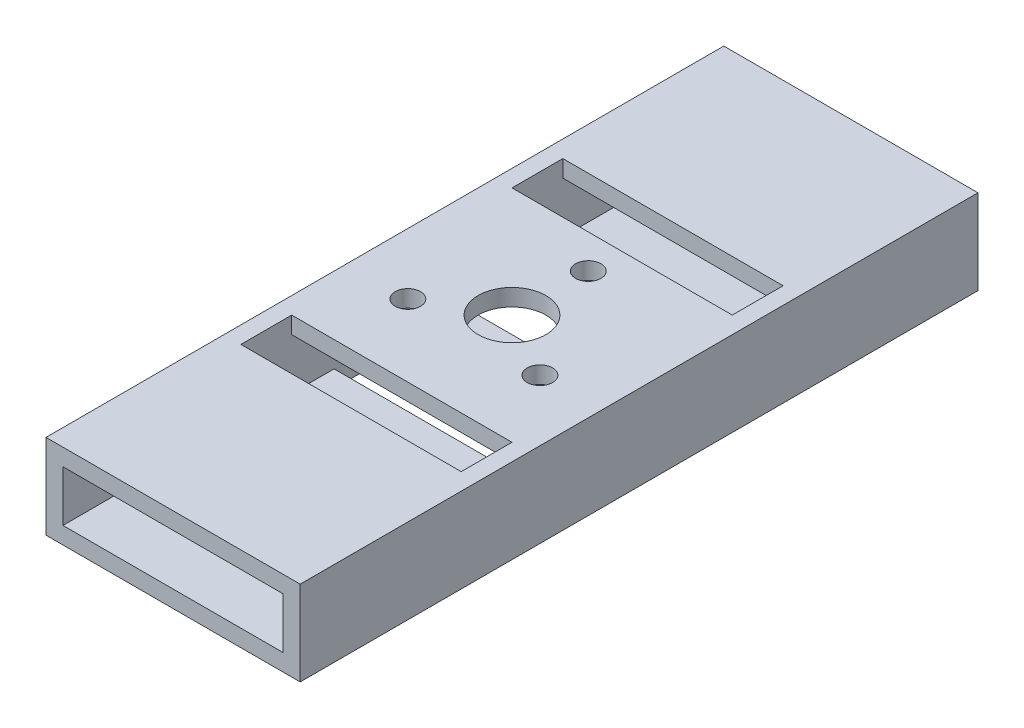
ISO-10303-21;
HEADER;
FILE_DESCRIPTION(('STEP AP214'),'2;1');
FILE_NAME('part.step','',(''),(''),'','','');
FILE_SCHEMA(('AUTOMOTIVE_DESIGN { 1 0 10303 214 1 1 1 1 }'));
ENDSEC;
DATA;
#1=APPLICATION_CONTEXT('core data for automotive mechanical design processes');
#2=APPLICATION_PROTOCOL_DEFINITION('international standard','automotive_design',2000,#1);
#3=PRODUCT_CONTEXT('',#1,'mechanical');
#4=PRODUCT('Part','Part','',(#3));
#5=PRODUCT_RELATED_PRODUCT_CATEGORY('part','',(#4));
#6=PRODUCT_DEFINITION_FORMATION('','',#4);
#7=PRODUCT_DEFINITION_CONTEXT('part definition',#1,'design');
#8=PRODUCT_DEFINITION('design','',#6,#7);
#9=PRODUCT_DEFINITION_SHAPE('','',#8);
#10=(LENGTH_UNIT() NAMED_UNIT(*) SI_UNIT(.MILLI.,.METRE.));
#11=(NAMED_UNIT(*) PLANE_ANGLE_UNIT() SI_UNIT($,.RADIAN.));
#12=(NAMED_UNIT(*) SI_UNIT($,.STERADIAN.) SOLID_ANGLE_UNIT());
#13=UNCERTAINTY_MEASURE_WITH_UNIT(LENGTH_MEASURE(1.E-05),#10,'distance_accuracy_value','');
#14=(GEOMETRIC_REPRESENTATION_CONTEXT(3) GLOBAL_UNCERTAINTY_ASSIGNED_CONTEXT((#13)) GLOBAL_UNIT_ASSIGNED_CONTEXT((#10,
#11,#12)) REPRESENTATION_CONTEXT('',''));
#15=CARTESIAN_POINT('',(0.,0.,0.));
#16=DIRECTION('',(0.,0.,1.));
#17=DIRECTION('',(1.,0.,0.));
#18=AXIS2_PLACEMENT_3D('',#15,#16,#17);
#19=CARTESIAN_POINT('',(-13.,-3.,80.));
#20=DIRECTION('',(0.,1.,0.));
#21=DIRECTION('',(0.,0.,1.));
#22=AXIS2_PLACEMENT_3D('',#19,#20,#21);
#23=PLANE('',#22);
#24=DIRECTION('',(1.,0.,0.));
#25=VECTOR('',#24,1.);
#26=CARTESIAN_POINT('',(-13.,-3.,40.));
#27=LINE('',#26,#25);
#28=CARTESIAN_POINT('',(4.,-3.,40.));
#29=VERTEX_POINT('',#28);
#30=CARTESIAN_POINT('',(13.,-3.,40.));
#31=VERTEX_POINT('',#30);
#32=EDGE_CURVE('E62',#29,#31,#27,.T.);
#33=ORIENTED_EDGE('',*,*,#32,.T.);
#34=DIRECTION('',(0.,0.,-1.));
#35=VECTOR('',#34,1.);
#36=CARTESIAN_POINT('',(13.,-3.,80.));
#37=LINE('',#36,#35);
#38=CARTESIAN_POINT('',(13.,-3.,34.));
#39=VERTEX_POINT('',#38);
#40=EDGE_CURVE('E248',#31,#39,#37,.T.);
#41=ORIENTED_EDGE('',*,*,#40,.T.);
#42=DIRECTION('',(-1.,0.,0.));
#43=VECTOR('',#42,1.);
#44=CARTESIAN_POINT('',(-13.,-3.,34.));
#45=LINE('',#44,#43);
#46=CARTESIAN_POINT('',(-13.,-3.,34.));
#47=VERTEX_POINT('',#46);
#48=EDGE_CURVE('E387',#39,#47,#45,.T.);
#49=ORIENTED_EDGE('',*,*,#48,.T.);
#50=DIRECTION('',(0.,0.,-1.));
#51=VECTOR('',#50,1.);
#52=CARTESIAN_POINT('',(-13.,-3.,80.));
#53=LINE('',#52,#51);
#54=CARTESIAN_POINT('',(-13.,-3.,40.));
#55=VERTEX_POINT('',#54);
#56=EDGE_CURVE('E251',#55,#47,#53,.T.);
#57=ORIENTED_EDGE('',*,*,#56,.F.);
#58=CARTESIAN_POINT('',(-4.,-3.,40.));
#59=VERTEX_POINT('',#58);
#60=EDGE_CURVE('E234',#55,#59,#27,.T.);
#61=ORIENTED_EDGE('',*,*,#60,.T.);
#62=CARTESIAN_POINT('',(0.,-3.,40.));
#63=DIRECTION('',(0.,1.,0.));
#64=DIRECTION('',(0.,0.,1.));
#65=AXIS2_PLACEMENT_3D('',#62,#63,#64);
#66=CIRCLE('',#65,4.);
#67=EDGE_CURVE('E285',#29,#59,#66,.T.);
#68=ORIENTED_EDGE('',*,*,#67,.F.);
#69=EDGE_LOOP('',(#33,#41,#49,#57,#61,#68));
#70=FACE_BOUND('',#69,.T.);
#71=ADVANCED_FACE('F47',(#70),#23,.T.);
#72=DIRECTION('',(1.,0.,0.));
#73=VECTOR('',#72,1.);
#74=CARTESIAN_POINT('',(-13.,-3.,28.));
#75=LINE('',#74,#73);
#76=CARTESIAN_POINT('',(-13.,-3.,28.));
#77=VERTEX_POINT('',#76);
#78=CARTESIAN_POINT('',(13.,-3.,28.));
#79=VERTEX_POINT('',#78);
#80=EDGE_CURVE('E379',#77,#79,#75,.T.);
#81=ORIENTED_EDGE('',*,*,#80,.T.);
#82=CARTESIAN_POINT('',(13.,-3.,0.));
#83=VERTEX_POINT('',#82);
#84=EDGE_CURVE('E250',#79,#83,#37,.T.);
#85=ORIENTED_EDGE('',*,*,#84,.T.);
#86=DIRECTION('',(1.,0.,0.));
#87=VECTOR('',#86,1.);
#88=CARTESIAN_POINT('',(-13.,-3.,0.));
#89=LINE('',#88,#87);
#90=CARTESIAN_POINT('',(-13.,-3.,0.));
#91=VERTEX_POINT('',#90);
#92=EDGE_CURVE('E275',#91,#83,#89,.T.);
#93=ORIENTED_EDGE('',*,*,#92,.F.);
#94=EDGE_CURVE('E247',#77,#91,#53,.T.);
#95=ORIENTED_EDGE('',*,*,#94,.F.);
#96=EDGE_LOOP('',(#81,#85,#93,#95));
#97=FACE_BOUND('',#96,.T.);
#98=CARTESIAN_POINT('',(0.,-3.,24.));
#99=DIRECTION('',(0.,1.,0.));
#100=DIRECTION('',(0.,0.,1.));
#101=AXIS2_PLACEMENT_3D('',#98,#99,#100);
#102=CIRCLE('',#101,2.);
#103=CARTESIAN_POINT('',(0.,-3.,26.));
#104=VERTEX_POINT('',#103);
#105=EDGE_CURVE('E314',#104,#104,#102,.T.);
#106=ORIENTED_EDGE('',*,*,#105,.F.);
#107=EDGE_LOOP('',(#106));
#108=FACE_BOUND('',#107,.T.);
#109=ADVANCED_FACE('F520',(#97,#108),#23,.T.);
#110=CARTESIAN_POINT('',(-13.,3.,80.));
#111=DIRECTION('',(0.,-1.,0.));
#112=DIRECTION('',(0.,0.,-1.));
#113=AXIS2_PLACEMENT_3D('',#110,#111,#112);
#114=PLANE('',#113);
#115=DIRECTION('',(0.,0.,-1.));
#116=VECTOR('',#115,1.);
#117=CARTESIAN_POINT('',(-13.,3.,80.));
#118=LINE('',#117,#116);
#119=CARTESIAN_POINT('',(-13.,3.,80.));
#120=VERTEX_POINT('',#119);
#121=CARTESIAN_POINT('',(-13.,3.,59.));
#122=VERTEX_POINT('',#121);
#123=EDGE_CURVE('E426',#120,#122,#118,.T.);
#124=ORIENTED_EDGE('',*,*,#123,.T.);
#125=DIRECTION('',(-1.,0.,0.));
#126=VECTOR('',#125,1.);
#127=CARTESIAN_POINT('',(-13.,3.,59.));
#128=LINE('',#127,#126);
#129=CARTESIAN_POINT('',(13.,3.,59.));
#130=VERTEX_POINT('',#129);
#131=EDGE_CURVE('E353',#130,#122,#128,.T.);
#132=ORIENTED_EDGE('',*,*,#131,.F.);
#133=DIRECTION('',(0.,0.,-1.));
#134=VECTOR('',#133,1.);
#135=CARTESIAN_POINT('',(13.,3.,80.));
#136=LINE('',#135,#134);
#137=CARTESIAN_POINT('',(13.,3.,80.));
#138=VERTEX_POINT('',#137);
#139=EDGE_CURVE('E431',#138,#130,#136,.T.);
#140=ORIENTED_EDGE('',*,*,#139,.F.);
#141=DIRECTION('',(-1.,0.,0.));
#142=VECTOR('',#141,1.);
#143=CARTESIAN_POINT('',(-13.,3.,80.));
#144=LINE('',#143,#142);
#145=EDGE_CURVE('E262',#138,#120,#144,.T.);
#146=ORIENTED_EDGE('',*,*,#145,.T.);
#147=EDGE_LOOP('',(#124,#132,#140,#146));
#148=FACE_BOUND('',#147,.T.);
#149=ADVANCED_FACE('F482',(#148),#114,.T.);
#150=CARTESIAN_POINT('',(0.,3.,31.));
#151=DIRECTION('',(0.,1.,0.));
#152=DIRECTION('',(0.,0.,1.));
#153=AXIS2_PLACEMENT_3D('',#150,#151,#152);
#154=CIRCLE('',#153,1.5);
#155=CARTESIAN_POINT('',(0.,3.,32.5));
#156=VERTEX_POINT('',#155);
#157=EDGE_CURVE('E290',#156,#156,#154,.T.);
#158=ORIENTED_EDGE('',*,*,#157,.T.);
#159=EDGE_LOOP('',(#158));
#160=FACE_BOUND('',#159,.T.);
#161=CARTESIAN_POINT('',(7.7942286340609,3.,44.4999999999995));
#162=DIRECTION('',(0.,1.,0.));
#163=DIRECTION('',(0.,0.,1.));
#164=AXIS2_PLACEMENT_3D('',#161,#162,#163);
#165=CIRCLE('',#164,1.5);
#166=CARTESIAN_POINT('',(7.7942286340609,3.,45.9999999999995));
#167=VERTEX_POINT('',#166);
#168=EDGE_CURVE('E303',#167,#167,#165,.T.);
#169=ORIENTED_EDGE('',*,*,#168,.T.);
#170=EDGE_LOOP('',(#169));
#171=FACE_BOUND('',#170,.T.);
#172=CARTESIAN_POINT('',(-7.79422863405903,3.,44.5000000000005));
#173=DIRECTION('',(0.,1.,0.));
#174=DIRECTION('',(0.,0.,1.));
#175=AXIS2_PLACEMENT_3D('',#172,#173,#174);
#176=CIRCLE('',#175,1.5);
#177=CARTESIAN_POINT('',(-7.79422863405903,3.,46.0000000000005));
#178=VERTEX_POINT('',#177);
#179=EDGE_CURVE('E296',#178,#178,#176,.T.);
#180=ORIENTED_EDGE('',*,*,#179,.T.);
#181=EDGE_LOOP('',(#180));
#182=FACE_BOUND('',#181,.T.);
#183=CARTESIAN_POINT('',(0.,3.,40.));
#184=DIRECTION('',(0.,-1.,0.));
#185=DIRECTION('',(0.,0.,-1.));
#186=AXIS2_PLACEMENT_3D('',#183,#184,#185);
#187=CIRCLE('',#186,4.);
#188=CARTESIAN_POINT('',(0.,3.,36.));
#189=VERTEX_POINT('',#188);
#190=EDGE_CURVE('E270',#189,#189,#187,.T.);
#191=ORIENTED_EDGE('',*,*,#190,.F.);
#192=EDGE_LOOP('',(#191));
#193=FACE_BOUND('',#192,.T.);
#194=CARTESIAN_POINT('',(13.,3.,53.));
#195=VERTEX_POINT('',#194);
#196=CARTESIAN_POINT('',(13.,3.,27.));
#197=VERTEX_POINT('',#196);
#198=EDGE_CURVE('E434',#195,#197,#136,.T.);
#199=ORIENTED_EDGE('',*,*,#198,.F.);
#200=DIRECTION('',(1.,0.,0.));
#201=VECTOR('',#200,1.);
#202=CARTESIAN_POINT('',(-13.,3.,53.));
#203=LINE('',#202,#201);
#204=CARTESIAN_POINT('',(-13.,3.,53.));
#205=VERTEX_POINT('',#204);
#206=EDGE_CURVE('E362',#205,#195,#203,.T.);
#207=ORIENTED_EDGE('',*,*,#206,.F.);
#208=CARTESIAN_POINT('',(-13.,3.,27.));
#209=VERTEX_POINT('',#208);
#210=EDGE_CURVE('E430',#205,#209,#118,.T.);
#211=ORIENTED_EDGE('',*,*,#210,.T.);
#212=DIRECTION('',(1.,0.,0.));
#213=VECTOR('',#212,1.);
#214=CARTESIAN_POINT('',(-13.,3.,27.));
#215=LINE('',#214,#213);
#216=EDGE_CURVE('E327',#209,#197,#215,.T.);
#217=ORIENTED_EDGE('',*,*,#216,.T.);
#218=EDGE_LOOP('',(#199,#207,#211,#217));
#219=FACE_BOUND('',#218,.T.);
#220=ADVANCED_FACE('F496',(#160,#171,#182,#193,#219),#114,.T.);
#221=CARTESIAN_POINT('',(-15.,5.,80.));
#222=DIRECTION('',(0.,-1.,0.));
#223=DIRECTION('',(0.,0.,-1.));
#224=AXIS2_PLACEMENT_3D('',#221,#222,#223);
#225=PLANE('',#224);
#226=DIRECTION('',(-1.,0.,0.));
#227=VECTOR('',#226,1.);
#228=CARTESIAN_POINT('',(-15.,5.,0.));
#229=LINE('',#228,#227);
#230=CARTESIAN_POINT('',(15.,5.,0.));
#231=VERTEX_POINT('',#230);
#232=CARTESIAN_POINT('',(-15.,5.,0.));
#233=VERTEX_POINT('',#232);
#234=EDGE_CURVE('E448',#231,#233,#229,.T.);
#235=ORIENTED_EDGE('',*,*,#234,.T.);
#236=DIRECTION('',(0.,0.,-1.));
#237=VECTOR('',#236,1.);
#238=CARTESIAN_POINT('',(-15.,5.,80.));
#239=LINE('',#238,#237);
#240=CARTESIAN_POINT('',(-15.,5.,80.));
#241=VERTEX_POINT('',#240);
#242=EDGE_CURVE('E458',#241,#233,#239,.T.);
#243=ORIENTED_EDGE('',*,*,#242,.F.);
#244=DIRECTION('',(-1.,0.,0.));
#245=VECTOR('',#244,1.);
#246=CARTESIAN_POINT('',(-15.,5.,80.));
#247=LINE('',#246,#245);
#248=CARTESIAN_POINT('',(15.,5.,80.));
#249=VERTEX_POINT('',#248);
#250=EDGE_CURVE('E438',#249,#241,#247,.T.);
#251=ORIENTED_EDGE('',*,*,#250,.F.);
#252=DIRECTION('',(0.,0.,-1.));
#253=VECTOR('',#252,1.);
#254=CARTESIAN_POINT('',(15.,5.,80.));
#255=LINE('',#254,#253);
#256=EDGE_CURVE('E461',#249,#231,#255,.T.);
#257=ORIENTED_EDGE('',*,*,#256,.T.);
#258=EDGE_LOOP('',(#235,#243,#251,#257));
#259=FACE_BOUND('',#258,.T.);
#260=CARTESIAN_POINT('',(0.,5.,40.));
#261=DIRECTION('',(0.,1.,0.));
#262=DIRECTION('',(0.,0.,1.));
#263=AXIS2_PLACEMENT_3D('',#260,#261,#262);
#264=CIRCLE('',#263,4.);
#265=CARTESIAN_POINT('',(0.,5.,44.));
#266=VERTEX_POINT('',#265);
#267=EDGE_CURVE('E286',#266,#266,#264,.T.);
#268=ORIENTED_EDGE('',*,*,#267,.F.);
#269=EDGE_LOOP('',(#268));
#270=FACE_BOUND('',#269,.T.);
#271=CARTESIAN_POINT('',(-7.79422863405903,5.,44.5000000000005));
#272=DIRECTION('',(0.,1.,0.));
#273=DIRECTION('',(0.,0.,1.));
#274=AXIS2_PLACEMENT_3D('',#271,#272,#273);
#275=CIRCLE('',#274,1.5);
#276=CARTESIAN_POINT('',(-7.79422863405903,5.,46.0000000000005));
#277=VERTEX_POINT('',#276);
#278=EDGE_CURVE('E293',#277,#277,#275,.T.);
#279=ORIENTED_EDGE('',*,*,#278,.F.);
#280=EDGE_LOOP('',(#279));
#281=FACE_BOUND('',#280,.T.);
#282=CARTESIAN_POINT('',(7.7942286340609,5.,44.4999999999995));
#283=DIRECTION('',(0.,1.,0.));
#284=DIRECTION('',(0.,0.,1.));
#285=AXIS2_PLACEMENT_3D('',#282,#283,#284);
#286=CIRCLE('',#285,1.5);
#287=CARTESIAN_POINT('',(7.7942286340609,5.,45.9999999999995));
#288=VERTEX_POINT('',#287);
#289=EDGE_CURVE('E300',#288,#288,#286,.T.);
#290=ORIENTED_EDGE('',*,*,#289,.F.);
#291=EDGE_LOOP('',(#290));
#292=FACE_BOUND('',#291,.T.);
#293=CARTESIAN_POINT('',(0.,5.,31.));
#294=DIRECTION('',(0.,1.,0.));
#295=DIRECTION('',(0.,0.,1.));
#296=AXIS2_PLACEMENT_3D('',#293,#294,#295);
#297=CIRCLE('',#296,1.5);
#298=CARTESIAN_POINT('',(0.,5.,32.5));
#299=VERTEX_POINT('',#298);
#300=EDGE_CURVE('E306',#299,#299,#297,.T.);
#301=ORIENTED_EDGE('',*,*,#300,.F.);
#302=EDGE_LOOP('',(#301));
#303=FACE_BOUND('',#302,.T.);
#304=DIRECTION('',(-1.,0.,0.));
#305=VECTOR('',#304,1.);
#306=CARTESIAN_POINT('',(-13.,5.,21.));
#307=LINE('',#306,#305);
#308=CARTESIAN_POINT('',(13.,5.,21.));
#309=VERTEX_POINT('',#308);
#310=CARTESIAN_POINT('',(-13.,5.,21.));
#311=VERTEX_POINT('',#310);
#312=EDGE_CURVE('E339',#309,#311,#307,.T.);
#313=ORIENTED_EDGE('',*,*,#312,.F.);
#314=DIRECTION('',(0.,0.,-1.));
#315=VECTOR('',#314,1.);
#316=CARTESIAN_POINT('',(13.,5.,21.));
#317=LINE('',#316,#315);
#318=CARTESIAN_POINT('',(13.,5.,27.));
#319=VERTEX_POINT('',#318);
#320=EDGE_CURVE('E342',#319,#309,#317,.T.);
#321=ORIENTED_EDGE('',*,*,#320,.F.);
#322=DIRECTION('',(1.,0.,0.));
#323=VECTOR('',#322,1.);
#324=CARTESIAN_POINT('',(-13.,5.,27.));
#325=LINE('',#324,#323);
#326=CARTESIAN_POINT('',(-13.,5.,27.));
#327=VERTEX_POINT('',#326);
#328=EDGE_CURVE('E332',#327,#319,#325,.T.);
#329=ORIENTED_EDGE('',*,*,#328,.F.);
#330=DIRECTION('',(0.,0.,1.));
#331=VECTOR('',#330,1.);
#332=CARTESIAN_POINT('',(-13.,5.,21.));
#333=LINE('',#332,#331);
#334=EDGE_CURVE('E336',#311,#327,#333,.T.);
#335=ORIENTED_EDGE('',*,*,#334,.F.);
#336=EDGE_LOOP('',(#313,#321,#329,#335));
#337=FACE_BOUND('',#336,.T.);
#338=DIRECTION('',(0.,0.,1.));
#339=VECTOR('',#338,1.);
#340=CARTESIAN_POINT('',(13.,5.,59.));
#341=LINE('',#340,#339);
#342=CARTESIAN_POINT('',(13.,5.,53.));
#343=VERTEX_POINT('',#342);
#344=CARTESIAN_POINT('',(13.,5.,59.));
#345=VERTEX_POINT('',#344);
#346=EDGE_CURVE('E369',#343,#345,#341,.T.);
#347=ORIENTED_EDGE('',*,*,#346,.T.);
#348=DIRECTION('',(-1.,0.,0.));
#349=VECTOR('',#348,1.);
#350=CARTESIAN_POINT('',(-13.,5.,59.));
#351=LINE('',#350,#349);
#352=CARTESIAN_POINT('',(-13.,5.,59.));
#353=VERTEX_POINT('',#352);
#354=EDGE_CURVE('E359',#345,#353,#351,.T.);
#355=ORIENTED_EDGE('',*,*,#354,.T.);
#356=DIRECTION('',(0.,0.,-1.));
#357=VECTOR('',#356,1.);
#358=CARTESIAN_POINT('',(-13.,5.,59.));
#359=LINE('',#358,#357);
#360=CARTESIAN_POINT('',(-13.,5.,53.));
#361=VERTEX_POINT('',#360);
#362=EDGE_CURVE('E363',#353,#361,#359,.T.);
#363=ORIENTED_EDGE('',*,*,#362,.T.);
#364=DIRECTION('',(1.,0.,0.));
#365=VECTOR('',#364,1.);
#366=CARTESIAN_POINT('',(-13.,5.,53.));
#367=LINE('',#366,#365);
#368=EDGE_CURVE('E366',#361,#343,#367,.T.);
#369=ORIENTED_EDGE('',*,*,#368,.T.);
#370=EDGE_LOOP('',(#347,#355,#363,#369));
#371=FACE_BOUND('',#370,.T.);
#372=ADVANCED_FACE('F487',(#259,#270,#281,#292,#303,#337,#371),#225,.F.);
#373=CARTESIAN_POINT('',(0.,0.,80.));
#374=DIRECTION('',(0.,0.,-1.));
#375=DIRECTION('',(-1.,0.,0.));
#376=AXIS2_PLACEMENT_3D('',#373,#374,#375);
#377=PLANE('',#376);
#378=DIRECTION('',(0.,1.,0.));
#379=VECTOR('',#378,1.);
#380=CARTESIAN_POINT('',(15.,-5.,80.));
#381=LINE('',#380,#379);
#382=CARTESIAN_POINT('',(15.,-5.,80.));
#383=VERTEX_POINT('',#382);
#384=EDGE_CURVE('E435',#383,#249,#381,.T.);
#385=ORIENTED_EDGE('',*,*,#384,.T.);
#386=ORIENTED_EDGE('',*,*,#250,.T.);
#387=DIRECTION('',(0.,-1.,0.));
#388=VECTOR('',#387,1.);
#389=CARTESIAN_POINT('',(-15.,-5.,80.));
#390=LINE('',#389,#388);
#391=CARTESIAN_POINT('',(-15.,-5.,80.));
#392=VERTEX_POINT('',#391);
#393=EDGE_CURVE('E441',#241,#392,#390,.T.);
#394=ORIENTED_EDGE('',*,*,#393,.T.);
#395=DIRECTION('',(1.,0.,0.));
#396=VECTOR('',#395,1.);
#397=CARTESIAN_POINT('',(-15.,-5.,80.));
#398=LINE('',#397,#396);
#399=EDGE_CURVE('E443',#392,#383,#398,.T.);
#400=ORIENTED_EDGE('',*,*,#399,.T.);
#401=EDGE_LOOP('',(#385,#386,#394,#400));
#402=FACE_BOUND('',#401,.T.);
#403=DIRECTION('',(0.,1.,0.));
#404=VECTOR('',#403,1.);
#405=CARTESIAN_POINT('',(13.,3.,80.));
#406=LINE('',#405,#404);
#407=CARTESIAN_POINT('',(13.,-3.,80.));
#408=VERTEX_POINT('',#407);
#409=EDGE_CURVE('E277',#408,#138,#406,.T.);
#410=ORIENTED_EDGE('',*,*,#409,.F.);
#411=DIRECTION('',(1.,0.,0.));
#412=VECTOR('',#411,1.);
#413=CARTESIAN_POINT('',(-13.,-3.,80.));
#414=LINE('',#413,#412);
#415=CARTESIAN_POINT('',(-13.,-3.,80.));
#416=VERTEX_POINT('',#415);
#417=EDGE_CURVE('E246',#416,#408,#414,.T.);
#418=ORIENTED_EDGE('',*,*,#417,.F.);
#419=DIRECTION('',(0.,-1.,0.));
#420=VECTOR('',#419,1.);
#421=CARTESIAN_POINT('',(-13.,3.,80.));
#422=LINE('',#421,#420);
#423=EDGE_CURVE('E259',#120,#416,#422,.T.);
#424=ORIENTED_EDGE('',*,*,#423,.F.);
#425=ORIENTED_EDGE('',*,*,#145,.F.);
#426=EDGE_LOOP('',(#410,#418,#424,#425));
#427=FACE_BOUND('',#426,.T.);
#428=ADVANCED_FACE('F480',(#402,#427),#377,.F.);
#429=CARTESIAN_POINT('',(0.,0.,0.));
#430=DIRECTION('',(0.,0.,-1.));
#431=DIRECTION('',(-1.,0.,0.));
#432=AXIS2_PLACEMENT_3D('',#429,#430,#431);
#433=PLANE('',#432);
#434=DIRECTION('',(0.,1.,0.));
#435=VECTOR('',#434,1.);
#436=CARTESIAN_POINT('',(15.,-5.,0.));
#437=LINE('',#436,#435);
#438=CARTESIAN_POINT('',(15.,-5.,0.));
#439=VERTEX_POINT('',#438);
#440=EDGE_CURVE('E433',#439,#231,#437,.T.);
#441=ORIENTED_EDGE('',*,*,#440,.F.);
#442=DIRECTION('',(1.,0.,0.));
#443=VECTOR('',#442,1.);
#444=CARTESIAN_POINT('',(-15.,-5.,0.));
#445=LINE('',#444,#443);
#446=CARTESIAN_POINT('',(-15.,-5.,0.));
#447=VERTEX_POINT('',#446);
#448=EDGE_CURVE('E439',#447,#439,#445,.T.);
#449=ORIENTED_EDGE('',*,*,#448,.F.);
#450=DIRECTION('',(0.,-1.,0.));
#451=VECTOR('',#450,1.);
#452=CARTESIAN_POINT('',(-15.,-5.,0.));
#453=LINE('',#452,#451);
#454=EDGE_CURVE('E450',#233,#447,#453,.T.);
#455=ORIENTED_EDGE('',*,*,#454,.F.);
#456=ORIENTED_EDGE('',*,*,#234,.F.);
#457=EDGE_LOOP('',(#441,#449,#455,#456));
#458=FACE_BOUND('',#457,.T.);
#459=ORIENTED_EDGE('',*,*,#92,.T.);
#460=DIRECTION('',(0.,1.,0.));
#461=VECTOR('',#460,1.);
#462=CARTESIAN_POINT('',(13.,3.,0.));
#463=LINE('',#462,#461);
#464=CARTESIAN_POINT('',(13.,3.,0.));
#465=VERTEX_POINT('',#464);
#466=EDGE_CURVE('E266',#83,#465,#463,.T.);
#467=ORIENTED_EDGE('',*,*,#466,.T.);
#468=DIRECTION('',(-1.,0.,0.));
#469=VECTOR('',#468,1.);
#470=CARTESIAN_POINT('',(-13.,3.,0.));
#471=LINE('',#470,#469);
#472=CARTESIAN_POINT('',(-13.,3.,0.));
#473=VERTEX_POINT('',#472);
#474=EDGE_CURVE('E269',#465,#473,#471,.T.);
#475=ORIENTED_EDGE('',*,*,#474,.T.);
#476=DIRECTION('',(0.,-1.,0.));
#477=VECTOR('',#476,1.);
#478=CARTESIAN_POINT('',(-13.,3.,0.));
#479=LINE('',#478,#477);
#480=EDGE_CURVE('E273',#473,#91,#479,.T.);
#481=ORIENTED_EDGE('',*,*,#480,.T.);
#482=EDGE_LOOP('',(#459,#467,#475,#481));
#483=FACE_BOUND('',#482,.T.);
#484=ADVANCED_FACE('F505',(#458,#483),#433,.T.);
#485=CARTESIAN_POINT('',(15.,-5.,80.));
#486=DIRECTION('',(-1.,0.,0.));
#487=DIRECTION('',(0.,0.,1.));
#488=AXIS2_PLACEMENT_3D('',#485,#486,#487);
#489=PLANE('',#488);
#490=ORIENTED_EDGE('',*,*,#440,.T.);
#491=ORIENTED_EDGE('',*,*,#256,.F.);
#492=ORIENTED_EDGE('',*,*,#384,.F.);
#493=DIRECTION('',(0.,0.,-1.));
#494=VECTOR('',#493,1.);
#495=CARTESIAN_POINT('',(15.,-5.,80.));
#496=LINE('',#495,#494);
#497=EDGE_CURVE('E445',#383,#439,#496,.T.);
#498=ORIENTED_EDGE('',*,*,#497,.T.);
#499=EDGE_LOOP('',(#490,#491,#492,#498));
#500=FACE_BOUND('',#499,.T.);
#501=ADVANCED_FACE('F49',(#500),#489,.F.);
#502=CARTESIAN_POINT('',(-15.,-5.,80.));
#503=DIRECTION('',(1.,0.,0.));
#504=DIRECTION('',(0.,0.,-1.));
#505=AXIS2_PLACEMENT_3D('',#502,#503,#504);
#506=PLANE('',#505);
#507=ORIENTED_EDGE('',*,*,#454,.T.);
#508=DIRECTION('',(0.,0.,-1.));
#509=VECTOR('',#508,1.);
#510=CARTESIAN_POINT('',(-15.,-5.,80.));
#511=LINE('',#510,#509);
#512=EDGE_CURVE('E455',#392,#447,#511,.T.);
#513=ORIENTED_EDGE('',*,*,#512,.F.);
#514=ORIENTED_EDGE('',*,*,#393,.F.);
#515=ORIENTED_EDGE('',*,*,#242,.T.);
#516=EDGE_LOOP('',(#507,#513,#514,#515));
#517=FACE_BOUND('',#516,.T.);
#518=ADVANCED_FACE('F513',(#517),#506,.F.);
#519=CARTESIAN_POINT('',(-15.,-5.,80.));
#520=DIRECTION('',(0.,1.,0.));
#521=DIRECTION('',(0.,0.,1.));
#522=AXIS2_PLACEMENT_3D('',#519,#520,#521);
#523=PLANE('',#522);
#524=DIRECTION('',(-1.,0.,0.));
#525=VECTOR('',#524,1.);
#526=CARTESIAN_POINT('',(-13.,-5.,34.));
#527=LINE('',#526,#525);
#528=CARTESIAN_POINT('',(13.,-5.,34.));
#529=VERTEX_POINT('',#528);
#530=CARTESIAN_POINT('',(-13.,-5.,34.));
#531=VERTEX_POINT('',#530);
#532=EDGE_CURVE('E391',#529,#531,#527,.T.);
#533=ORIENTED_EDGE('',*,*,#532,.F.);
#534=DIRECTION('',(0.,0.,1.));
#535=VECTOR('',#534,1.);
#536=CARTESIAN_POINT('',(13.,-5.,34.));
#537=LINE('',#536,#535);
#538=CARTESIAN_POINT('',(13.,-5.,28.));
#539=VERTEX_POINT('',#538);
#540=EDGE_CURVE('E70',#539,#529,#537,.T.);
#541=ORIENTED_EDGE('',*,*,#540,.F.);
#542=DIRECTION('',(1.,0.,0.));
#543=VECTOR('',#542,1.);
#544=CARTESIAN_POINT('',(-13.,-5.,28.));
#545=LINE('',#544,#543);
#546=CARTESIAN_POINT('',(-13.,-5.,28.));
#547=VERTEX_POINT('',#546);
#548=EDGE_CURVE('E384',#547,#539,#545,.T.);
#549=ORIENTED_EDGE('',*,*,#548,.F.);
#550=DIRECTION('',(0.,0.,-1.));
#551=VECTOR('',#550,1.);
#552=CARTESIAN_POINT('',(-13.,-5.,34.));
#553=LINE('',#552,#551);
#554=EDGE_CURVE('E388',#531,#547,#553,.T.);
#555=ORIENTED_EDGE('',*,*,#554,.F.);
#556=EDGE_LOOP('',(#533,#541,#549,#555));
#557=FACE_BOUND('',#556,.T.);
#558=CARTESIAN_POINT('',(0.,-5.,24.));
#559=DIRECTION('',(0.,1.,0.));
#560=DIRECTION('',(0.,0.,1.));
#561=AXIS2_PLACEMENT_3D('',#558,#559,#560);
#562=CIRCLE('',#561,2.);
#563=CARTESIAN_POINT('',(0.,-5.,26.));
#564=VERTEX_POINT('',#563);
#565=EDGE_CURVE('E317',#564,#564,#562,.T.);
#566=ORIENTED_EDGE('',*,*,#565,.T.);
#567=EDGE_LOOP('',(#566));
#568=FACE_BOUND('',#567,.T.);
#569=CARTESIAN_POINT('',(0.,-5.,56.));
#570=DIRECTION('',(0.,-1.,0.));
#571=DIRECTION('',(0.,0.,-1.));
#572=AXIS2_PLACEMENT_3D('',#569,#570,#571);
#573=CIRCLE('',#572,2.);
#574=CARTESIAN_POINT('',(0.,-5.,54.));
#575=VERTEX_POINT('',#574);
#576=EDGE_CURVE('E311',#575,#575,#573,.T.);
#577=ORIENTED_EDGE('',*,*,#576,.F.);
#578=EDGE_LOOP('',(#577));
#579=FACE_BOUND('',#578,.T.);
#580=DIRECTION('',(0.,0.,1.));
#581=VECTOR('',#580,1.);
#582=CARTESIAN_POINT('',(13.,-5.,40.));
#583=LINE('',#582,#581);
#584=CARTESIAN_POINT('',(13.,-5.,40.));
#585=VERTEX_POINT('',#584);
#586=CARTESIAN_POINT('',(13.,-5.,48.));
#587=VERTEX_POINT('',#586);
#588=EDGE_CURVE('E229',#585,#587,#583,.T.);
#589=ORIENTED_EDGE('',*,*,#588,.F.);
#590=DIRECTION('',(1.,0.,0.));
#591=VECTOR('',#590,1.);
#592=CARTESIAN_POINT('',(-13.,-5.,40.));
#593=LINE('',#592,#591);
#594=CARTESIAN_POINT('',(4.,-5.,40.));
#595=VERTEX_POINT('',#594);
#596=EDGE_CURVE('E404',#595,#585,#593,.T.);
#597=ORIENTED_EDGE('',*,*,#596,.F.);
#598=CARTESIAN_POINT('',(0.,-5.,40.));
#599=DIRECTION('',(0.,1.,0.));
#600=DIRECTION('',(0.,0.,1.));
#601=AXIS2_PLACEMENT_3D('',#598,#599,#600);
#602=CIRCLE('',#601,4.);
#603=CARTESIAN_POINT('',(-4.,-5.,40.));
#604=VERTEX_POINT('',#603);
#605=EDGE_CURVE('E289',#595,#604,#602,.T.);
#606=ORIENTED_EDGE('',*,*,#605,.T.);
#607=CARTESIAN_POINT('',(-13.,-5.,40.));
#608=VERTEX_POINT('',#607);
#609=EDGE_CURVE('E241',#608,#604,#593,.T.);
#610=ORIENTED_EDGE('',*,*,#609,.F.);
#611=DIRECTION('',(0.,0.,-1.));
#612=VECTOR('',#611,1.);
#613=CARTESIAN_POINT('',(-13.,-5.,40.));
#614=LINE('',#613,#612);
#615=CARTESIAN_POINT('',(-13.,-5.,48.));
#616=VERTEX_POINT('',#615);
#617=EDGE_CURVE('E405',#616,#608,#614,.T.);
#618=ORIENTED_EDGE('',*,*,#617,.F.);
#619=DIRECTION('',(-1.,0.,0.));
#620=VECTOR('',#619,1.);
#621=CARTESIAN_POINT('',(-13.,-5.,48.));
#622=LINE('',#621,#620);
#623=EDGE_CURVE('E408',#587,#616,#622,.T.);
#624=ORIENTED_EDGE('',*,*,#623,.F.);
#625=EDGE_LOOP('',(#589,#597,#606,#610,#618,#624));
#626=FACE_BOUND('',#625,.T.);
#627=ORIENTED_EDGE('',*,*,#448,.T.);
#628=ORIENTED_EDGE('',*,*,#497,.F.);
#629=ORIENTED_EDGE('',*,*,#399,.F.);
#630=ORIENTED_EDGE('',*,*,#512,.T.);
#631=EDGE_LOOP('',(#627,#628,#629,#630));
#632=FACE_BOUND('',#631,.T.);
#633=ADVANCED_FACE('F470',(#557,#568,#579,#626,#632),#523,.F.);
#634=CARTESIAN_POINT('',(13.,3.,80.));
#635=DIRECTION('',(-1.,0.,0.));
#636=DIRECTION('',(0.,0.,1.));
#637=AXIS2_PLACEMENT_3D('',#634,#635,#636);
#638=PLANE('',#637);
#639=ORIENTED_EDGE('',*,*,#466,.F.);
#640=ORIENTED_EDGE('',*,*,#84,.F.);
#641=DIRECTION('',(0.,-1.,0.));
#642=VECTOR('',#641,1.);
#643=CARTESIAN_POINT('',(13.,-3.,28.));
#644=LINE('',#643,#642);
#645=EDGE_CURVE('E372',#79,#539,#644,.T.);
#646=ORIENTED_EDGE('',*,*,#645,.T.);
#647=ORIENTED_EDGE('',*,*,#540,.T.);
#648=DIRECTION('',(0.,-1.,0.));
#649=VECTOR('',#648,1.);
#650=CARTESIAN_POINT('',(13.,-3.,34.));
#651=LINE('',#650,#649);
#652=EDGE_CURVE('E376',#39,#529,#651,.T.);
#653=ORIENTED_EDGE('',*,*,#652,.F.);
#654=ORIENTED_EDGE('',*,*,#40,.F.);
#655=DIRECTION('',(0.,-1.,0.));
#656=VECTOR('',#655,1.);
#657=CARTESIAN_POINT('',(13.,-3.,40.));
#658=LINE('',#657,#656);
#659=EDGE_CURVE('E395',#31,#585,#658,.T.);
#660=ORIENTED_EDGE('',*,*,#659,.T.);
#661=ORIENTED_EDGE('',*,*,#588,.T.);
#662=DIRECTION('',(0.,-1.,0.));
#663=VECTOR('',#662,1.);
#664=CARTESIAN_POINT('',(13.,-3.,48.));
#665=LINE('',#664,#663);
#666=CARTESIAN_POINT('',(13.,-3.,48.));
#667=VERTEX_POINT('',#666);
#668=EDGE_CURVE('E220',#667,#587,#665,.T.);
#669=ORIENTED_EDGE('',*,*,#668,.F.);
#670=EDGE_CURVE('E225',#408,#667,#37,.T.);
#671=ORIENTED_EDGE('',*,*,#670,.F.);
#672=ORIENTED_EDGE('',*,*,#409,.T.);
#673=ORIENTED_EDGE('',*,*,#139,.T.);
#674=DIRECTION('',(0.,1.,0.));
#675=VECTOR('',#674,1.);
#676=CARTESIAN_POINT('',(13.,3.,59.));
#677=LINE('',#676,#675);
#678=EDGE_CURVE('E344',#130,#345,#677,.T.);
#679=ORIENTED_EDGE('',*,*,#678,.T.);
#680=ORIENTED_EDGE('',*,*,#346,.F.);
#681=DIRECTION('',(0.,1.,0.));
#682=VECTOR('',#681,1.);
#683=CARTESIAN_POINT('',(13.,3.,53.));
#684=LINE('',#683,#682);
#685=EDGE_CURVE('E349',#195,#343,#684,.T.);
#686=ORIENTED_EDGE('',*,*,#685,.F.);
#687=ORIENTED_EDGE('',*,*,#198,.T.);
#688=DIRECTION('',(0.,1.,0.));
#689=VECTOR('',#688,1.);
#690=CARTESIAN_POINT('',(13.,3.,27.));
#691=LINE('',#690,#689);
#692=EDGE_CURVE('E320',#197,#319,#691,.T.);
#693=ORIENTED_EDGE('',*,*,#692,.T.);
#694=ORIENTED_EDGE('',*,*,#320,.T.);
#695=DIRECTION('',(0.,1.,0.));
#696=VECTOR('',#695,1.);
#697=CARTESIAN_POINT('',(13.,3.,21.));
#698=LINE('',#697,#696);
#699=CARTESIAN_POINT('',(13.,3.,21.));
#700=VERTEX_POINT('',#699);
#701=EDGE_CURVE('E323',#700,#309,#698,.T.);
#702=ORIENTED_EDGE('',*,*,#701,.F.);
#703=EDGE_CURVE('E429',#700,#465,#136,.T.);
#704=ORIENTED_EDGE('',*,*,#703,.T.);
#705=EDGE_LOOP('',(#639,#640,#646,#647,#653,#654,#660,#661,#669,#671,#672,#673,#679,#680,#686,
#687,#693,#694,#702,#704));
#706=FACE_BOUND('',#705,.T.);
#707=ADVANCED_FACE('F223',(#706),#638,.T.);
#708=DIRECTION('',(-1.,0.,0.));
#709=VECTOR('',#708,1.);
#710=CARTESIAN_POINT('',(-13.,3.,21.));
#711=LINE('',#710,#709);
#712=CARTESIAN_POINT('',(-13.,3.,21.));
#713=VERTEX_POINT('',#712);
#714=EDGE_CURVE('E335',#700,#713,#711,.T.);
#715=ORIENTED_EDGE('',*,*,#714,.T.);
#716=EDGE_CURVE('E424',#713,#473,#118,.T.);
#717=ORIENTED_EDGE('',*,*,#716,.T.);
#718=ORIENTED_EDGE('',*,*,#474,.F.);
#719=ORIENTED_EDGE('',*,*,#703,.F.);
#720=EDGE_LOOP('',(#715,#717,#718,#719));
#721=FACE_BOUND('',#720,.T.);
#722=ADVANCED_FACE('F503',(#721),#114,.T.);
#723=CARTESIAN_POINT('',(-13.,3.,80.));
#724=DIRECTION('',(1.,0.,0.));
#725=DIRECTION('',(0.,0.,-1.));
#726=AXIS2_PLACEMENT_3D('',#723,#724,#725);
#727=PLANE('',#726);
#728=ORIENTED_EDGE('',*,*,#480,.F.);
#729=ORIENTED_EDGE('',*,*,#716,.F.);
#730=DIRECTION('',(0.,1.,0.));
#731=VECTOR('',#730,1.);
#732=CARTESIAN_POINT('',(-13.,3.,21.));
#733=LINE('',#732,#731);
#734=EDGE_CURVE('E326',#713,#311,#733,.T.);
#735=ORIENTED_EDGE('',*,*,#734,.T.);
#736=ORIENTED_EDGE('',*,*,#334,.T.);
#737=DIRECTION('',(0.,1.,0.));
#738=VECTOR('',#737,1.);
#739=CARTESIAN_POINT('',(-13.,3.,27.));
#740=LINE('',#739,#738);
#741=EDGE_CURVE('E329',#209,#327,#740,.T.);
#742=ORIENTED_EDGE('',*,*,#741,.F.);
#743=ORIENTED_EDGE('',*,*,#210,.F.);
#744=DIRECTION('',(0.,1.,0.));
#745=VECTOR('',#744,1.);
#746=CARTESIAN_POINT('',(-13.,3.,53.));
#747=LINE('',#746,#745);
#748=EDGE_CURVE('E352',#205,#361,#747,.T.);
#749=ORIENTED_EDGE('',*,*,#748,.T.);
#750=ORIENTED_EDGE('',*,*,#362,.F.);
#751=DIRECTION('',(0.,1.,0.));
#752=VECTOR('',#751,1.);
#753=CARTESIAN_POINT('',(-13.,3.,59.));
#754=LINE('',#753,#752);
#755=EDGE_CURVE('E355',#122,#353,#754,.T.);
#756=ORIENTED_EDGE('',*,*,#755,.F.);
#757=ORIENTED_EDGE('',*,*,#123,.F.);
#758=ORIENTED_EDGE('',*,*,#423,.T.);
#759=CARTESIAN_POINT('',(-13.,-3.,48.));
#760=VERTEX_POINT('',#759);
#761=EDGE_CURVE('E253',#416,#760,#53,.T.);
#762=ORIENTED_EDGE('',*,*,#761,.T.);
#763=DIRECTION('',(0.,-1.,0.));
#764=VECTOR('',#763,1.);
#765=CARTESIAN_POINT('',(-13.,-3.,48.));
#766=LINE('',#765,#764);
#767=EDGE_CURVE('E233',#760,#616,#766,.T.);
#768=ORIENTED_EDGE('',*,*,#767,.T.);
#769=ORIENTED_EDGE('',*,*,#617,.T.);
#770=DIRECTION('',(0.,-1.,0.));
#771=VECTOR('',#770,1.);
#772=CARTESIAN_POINT('',(-13.,-3.,40.));
#773=LINE('',#772,#771);
#774=EDGE_CURVE('E400',#55,#608,#773,.T.);
#775=ORIENTED_EDGE('',*,*,#774,.F.);
#776=ORIENTED_EDGE('',*,*,#56,.T.);
#777=DIRECTION('',(0.,-1.,0.));
#778=VECTOR('',#777,1.);
#779=CARTESIAN_POINT('',(-13.,-3.,34.));
#780=LINE('',#779,#778);
#781=EDGE_CURVE('E378',#47,#531,#780,.T.);
#782=ORIENTED_EDGE('',*,*,#781,.T.);
#783=ORIENTED_EDGE('',*,*,#554,.T.);
#784=DIRECTION('',(0.,-1.,0.));
#785=VECTOR('',#784,1.);
#786=CARTESIAN_POINT('',(-13.,-3.,28.));
#787=LINE('',#786,#785);
#788=EDGE_CURVE('E381',#77,#547,#787,.T.);
#789=ORIENTED_EDGE('',*,*,#788,.F.);
#790=ORIENTED_EDGE('',*,*,#94,.T.);
#791=EDGE_LOOP('',(#728,#729,#735,#736,#742,#743,#749,#750,#756,#757,#758,#762,#768,#769,#775,
#776,#782,#783,#789,#790));
#792=FACE_BOUND('',#791,.T.);
#793=ADVANCED_FACE('F475',(#792),#727,.T.);
#794=DIRECTION('',(-1.,0.,0.));
#795=VECTOR('',#794,1.);
#796=CARTESIAN_POINT('',(-13.,-3.,48.));
#797=LINE('',#796,#795);
#798=EDGE_CURVE('E237',#667,#760,#797,.T.);
#799=ORIENTED_EDGE('',*,*,#798,.T.);
#800=ORIENTED_EDGE('',*,*,#761,.F.);
#801=ORIENTED_EDGE('',*,*,#417,.T.);
#802=ORIENTED_EDGE('',*,*,#670,.T.);
#803=EDGE_LOOP('',(#799,#800,#801,#802));
#804=FACE_BOUND('',#803,.T.);
#805=CARTESIAN_POINT('',(0.,-3.,56.));
#806=DIRECTION('',(0.,-1.,0.));
#807=DIRECTION('',(0.,0.,-1.));
#808=AXIS2_PLACEMENT_3D('',#805,#806,#807);
#809=CIRCLE('',#808,2.);
#810=CARTESIAN_POINT('',(0.,-3.,54.));
#811=VERTEX_POINT('',#810);
#812=EDGE_CURVE('E297',#811,#811,#809,.T.);
#813=ORIENTED_EDGE('',*,*,#812,.T.);
#814=EDGE_LOOP('',(#813));
#815=FACE_BOUND('',#814,.T.);
#816=ADVANCED_FACE('F243',(#804,#815),#23,.T.);
#817=CARTESIAN_POINT('',(0.,-5.,40.));
#818=DIRECTION('',(0.,1.,0.));
#819=DIRECTION('',(0.,0.,1.));
#820=AXIS2_PLACEMENT_3D('',#817,#818,#819);
#821=CYLINDRICAL_SURFACE('',#820,4.);
#822=ORIENTED_EDGE('',*,*,#67,.T.);
#823=DIRECTION('',(0.,1.,0.));
#824=VECTOR('',#823,1.);
#825=CARTESIAN_POINT('',(-4.,-5.,40.));
#826=LINE('',#825,#824);
#827=EDGE_CURVE('E13',#59,#604,#826,.F.);
#828=ORIENTED_EDGE('',*,*,#827,.T.);
#829=ORIENTED_EDGE('',*,*,#605,.F.);
#830=DIRECTION('',(0.,1.,0.));
#831=VECTOR('',#830,1.);
#832=CARTESIAN_POINT('',(4.,-5.,40.));
#833=LINE('',#832,#831);
#834=EDGE_CURVE('E55',#595,#29,#833,.T.);
#835=ORIENTED_EDGE('',*,*,#834,.T.);
#836=EDGE_LOOP('',(#822,#828,#829,#835));
#837=FACE_BOUND('',#836,.T.);
#838=ADVANCED_FACE('F466',(#837),#821,.F.);
#839=ORIENTED_EDGE('',*,*,#190,.T.);
#840=EDGE_LOOP('',(#839));
#841=FACE_BOUND('',#840,.T.);
#842=ORIENTED_EDGE('',*,*,#267,.T.);
#843=EDGE_LOOP('',(#842));
#844=FACE_BOUND('',#843,.T.);
#845=ADVANCED_FACE('F532',(#841,#844),#821,.F.);
#846=CARTESIAN_POINT('',(-7.79422863405903,3.,44.5000000000005));
#847=DIRECTION('',(0.,1.,0.));
#848=DIRECTION('',(0.,0.,1.));
#849=AXIS2_PLACEMENT_3D('',#846,#847,#848);
#850=CYLINDRICAL_SURFACE('',#849,1.5);
#851=ORIENTED_EDGE('',*,*,#179,.F.);
#852=EDGE_LOOP('',(#851));
#853=FACE_BOUND('',#852,.T.);
#854=ORIENTED_EDGE('',*,*,#278,.T.);
#855=EDGE_LOOP('',(#854));
#856=FACE_BOUND('',#855,.T.);
#857=ADVANCED_FACE('F599',(#853,#856),#850,.F.);
#858=CARTESIAN_POINT('',(7.7942286340609,3.,44.4999999999995));
#859=DIRECTION('',(0.,1.,0.));
#860=DIRECTION('',(0.,0.,1.));
#861=AXIS2_PLACEMENT_3D('',#858,#859,#860);
#862=CYLINDRICAL_SURFACE('',#861,1.5);
#863=ORIENTED_EDGE('',*,*,#168,.F.);
#864=EDGE_LOOP('',(#863));
#865=FACE_BOUND('',#864,.T.);
#866=ORIENTED_EDGE('',*,*,#289,.T.);
#867=EDGE_LOOP('',(#866));
#868=FACE_BOUND('',#867,.T.);
#869=ADVANCED_FACE('F595',(#865,#868),#862,.F.);
#870=CARTESIAN_POINT('',(0.,3.,31.));
#871=DIRECTION('',(0.,1.,0.));
#872=DIRECTION('',(0.,0.,1.));
#873=AXIS2_PLACEMENT_3D('',#870,#871,#872);
#874=CYLINDRICAL_SURFACE('',#873,1.5);
#875=ORIENTED_EDGE('',*,*,#157,.F.);
#876=EDGE_LOOP('',(#875));
#877=FACE_BOUND('',#876,.T.);
#878=ORIENTED_EDGE('',*,*,#300,.T.);
#879=EDGE_LOOP('',(#878));
#880=FACE_BOUND('',#879,.T.);
#881=ADVANCED_FACE('F591',(#877,#880),#874,.F.);
#882=CARTESIAN_POINT('',(0.,-3.,56.));
#883=DIRECTION('',(0.,-1.,0.));
#884=DIRECTION('',(0.,0.,-1.));
#885=AXIS2_PLACEMENT_3D('',#882,#883,#884);
#886=CYLINDRICAL_SURFACE('',#885,2.);
#887=ORIENTED_EDGE('',*,*,#812,.F.);
#888=EDGE_LOOP('',(#887));
#889=FACE_BOUND('',#888,.T.);
#890=ORIENTED_EDGE('',*,*,#576,.T.);
#891=EDGE_LOOP('',(#890));
#892=FACE_BOUND('',#891,.T.);
#893=ADVANCED_FACE('F583',(#889,#892),#886,.F.);
#894=CARTESIAN_POINT('',(0.,-3.,24.));
#895=DIRECTION('',(0.,-1.,0.));
#896=DIRECTION('',(0.,0.,-1.));
#897=AXIS2_PLACEMENT_3D('',#894,#895,#896);
#898=CYLINDRICAL_SURFACE('',#897,2.);
#899=ORIENTED_EDGE('',*,*,#105,.T.);
#900=EDGE_LOOP('',(#899));
#901=FACE_BOUND('',#900,.T.);
#902=ORIENTED_EDGE('',*,*,#565,.F.);
#903=EDGE_LOOP('',(#902));
#904=FACE_BOUND('',#903,.T.);
#905=ADVANCED_FACE('F575',(#901,#904),#898,.F.);
#906=CARTESIAN_POINT('',(-13.,3.,27.));
#907=DIRECTION('',(0.,0.,1.));
#908=DIRECTION('',(1.,0.,0.));
#909=AXIS2_PLACEMENT_3D('',#906,#907,#908);
#910=PLANE('',#909);
#911=ORIENTED_EDGE('',*,*,#328,.T.);
#912=ORIENTED_EDGE('',*,*,#692,.F.);
#913=ORIENTED_EDGE('',*,*,#216,.F.);
#914=ORIENTED_EDGE('',*,*,#741,.T.);
#915=EDGE_LOOP('',(#911,#912,#913,#914));
#916=FACE_BOUND('',#915,.T.);
#917=ADVANCED_FACE('F573',(#916),#910,.F.);
#918=CARTESIAN_POINT('',(-13.,3.,21.));
#919=DIRECTION('',(0.,0.,-1.));
#920=DIRECTION('',(-1.,0.,0.));
#921=AXIS2_PLACEMENT_3D('',#918,#919,#920);
#922=PLANE('',#921);
#923=ORIENTED_EDGE('',*,*,#312,.T.);
#924=ORIENTED_EDGE('',*,*,#734,.F.);
#925=ORIENTED_EDGE('',*,*,#714,.F.);
#926=ORIENTED_EDGE('',*,*,#701,.T.);
#927=EDGE_LOOP('',(#923,#924,#925,#926));
#928=FACE_BOUND('',#927,.T.);
#929=ADVANCED_FACE('F570',(#928),#922,.F.);
#930=CARTESIAN_POINT('',(-13.,3.,59.));
#931=DIRECTION('',(0.,0.,-1.));
#932=DIRECTION('',(-1.,0.,0.));
#933=AXIS2_PLACEMENT_3D('',#930,#931,#932);
#934=PLANE('',#933);
#935=ORIENTED_EDGE('',*,*,#354,.F.);
#936=ORIENTED_EDGE('',*,*,#678,.F.);
#937=ORIENTED_EDGE('',*,*,#131,.T.);
#938=ORIENTED_EDGE('',*,*,#755,.T.);
#939=EDGE_LOOP('',(#935,#936,#937,#938));
#940=FACE_BOUND('',#939,.T.);
#941=ADVANCED_FACE('F581',(#940),#934,.T.);
#942=CARTESIAN_POINT('',(-13.,3.,53.));
#943=DIRECTION('',(0.,0.,1.));
#944=DIRECTION('',(1.,0.,0.));
#945=AXIS2_PLACEMENT_3D('',#942,#943,#944);
#946=PLANE('',#945);
#947=ORIENTED_EDGE('',*,*,#368,.F.);
#948=ORIENTED_EDGE('',*,*,#748,.F.);
#949=ORIENTED_EDGE('',*,*,#206,.T.);
#950=ORIENTED_EDGE('',*,*,#685,.T.);
#951=EDGE_LOOP('',(#947,#948,#949,#950));
#952=FACE_BOUND('',#951,.T.);
#953=ADVANCED_FACE('F491',(#952),#946,.T.);
#954=CARTESIAN_POINT('',(-13.,-3.,28.));
#955=DIRECTION('',(0.,0.,-1.));
#956=DIRECTION('',(-1.,0.,0.));
#957=AXIS2_PLACEMENT_3D('',#954,#955,#956);
#958=PLANE('',#957);
#959=ORIENTED_EDGE('',*,*,#548,.T.);
#960=ORIENTED_EDGE('',*,*,#645,.F.);
#961=ORIENTED_EDGE('',*,*,#80,.F.);
#962=ORIENTED_EDGE('',*,*,#788,.T.);
#963=EDGE_LOOP('',(#959,#960,#961,#962));
#964=FACE_BOUND('',#963,.T.);
#965=ADVANCED_FACE('F654',(#964),#958,.F.);
#966=CARTESIAN_POINT('',(-13.,-3.,34.));
#967=DIRECTION('',(0.,0.,1.));
#968=DIRECTION('',(1.,0.,0.));
#969=AXIS2_PLACEMENT_3D('',#966,#967,#968);
#970=PLANE('',#969);
#971=ORIENTED_EDGE('',*,*,#532,.T.);
#972=ORIENTED_EDGE('',*,*,#781,.F.);
#973=ORIENTED_EDGE('',*,*,#48,.F.);
#974=ORIENTED_EDGE('',*,*,#652,.T.);
#975=EDGE_LOOP('',(#971,#972,#973,#974));
#976=FACE_BOUND('',#975,.T.);
#977=ADVANCED_FACE('F422',(#976),#970,.F.);
#978=CARTESIAN_POINT('',(-13.,-3.,40.));
#979=DIRECTION('',(0.,0.,-1.));
#980=DIRECTION('',(-1.,0.,0.));
#981=AXIS2_PLACEMENT_3D('',#978,#979,#980);
#982=PLANE('',#981);
#983=ORIENTED_EDGE('',*,*,#60,.F.);
#984=ORIENTED_EDGE('',*,*,#774,.T.);
#985=ORIENTED_EDGE('',*,*,#609,.T.);
#986=ORIENTED_EDGE('',*,*,#827,.F.);
#987=EDGE_LOOP('',(#983,#984,#985,#986));
#988=FACE_BOUND('',#987,.T.);
#989=ADVANCED_FACE('F627',(#988),#982,.F.);
#990=ORIENTED_EDGE('',*,*,#596,.T.);
#991=ORIENTED_EDGE('',*,*,#659,.F.);
#992=ORIENTED_EDGE('',*,*,#32,.F.);
#993=ORIENTED_EDGE('',*,*,#834,.F.);
#994=EDGE_LOOP('',(#990,#991,#992,#993));
#995=FACE_BOUND('',#994,.T.);
#996=ADVANCED_FACE('F468',(#995),#982,.F.);
#997=CARTESIAN_POINT('',(-13.,-3.,48.));
#998=DIRECTION('',(0.,0.,1.));
#999=DIRECTION('',(1.,0.,0.));
#1000=AXIS2_PLACEMENT_3D('',#997,#998,#999);
#1001=PLANE('',#1000);
#1002=ORIENTED_EDGE('',*,*,#623,.T.);
#1003=ORIENTED_EDGE('',*,*,#767,.F.);
#1004=ORIENTED_EDGE('',*,*,#798,.F.);
#1005=ORIENTED_EDGE('',*,*,#668,.T.);
#1006=EDGE_LOOP('',(#1002,#1003,#1004,#1005));
#1007=FACE_BOUND('',#1006,.T.);
#1008=ADVANCED_FACE('F238',(#1007),#1001,.F.);
#1009=CLOSED_SHELL('',(#71,#109,#149,#220,#372,#428,#484,#501,#518,#633,#707,#722,#793,#816,
#838,#845,#857,#869,#881,#893,#905,#917,#929,#941,#953,#965,#977,#989,#996,#1008));
#1010=MANIFOLD_SOLID_BREP('B2',#1009);
#1011=ADVANCED_BREP_SHAPE_REPRESENTATION('',(#18,#1010),#14);
#1012=SHAPE_DEFINITION_REPRESENTATION(#9,#1011);
ENDSEC;
END-ISO-10303-21;
